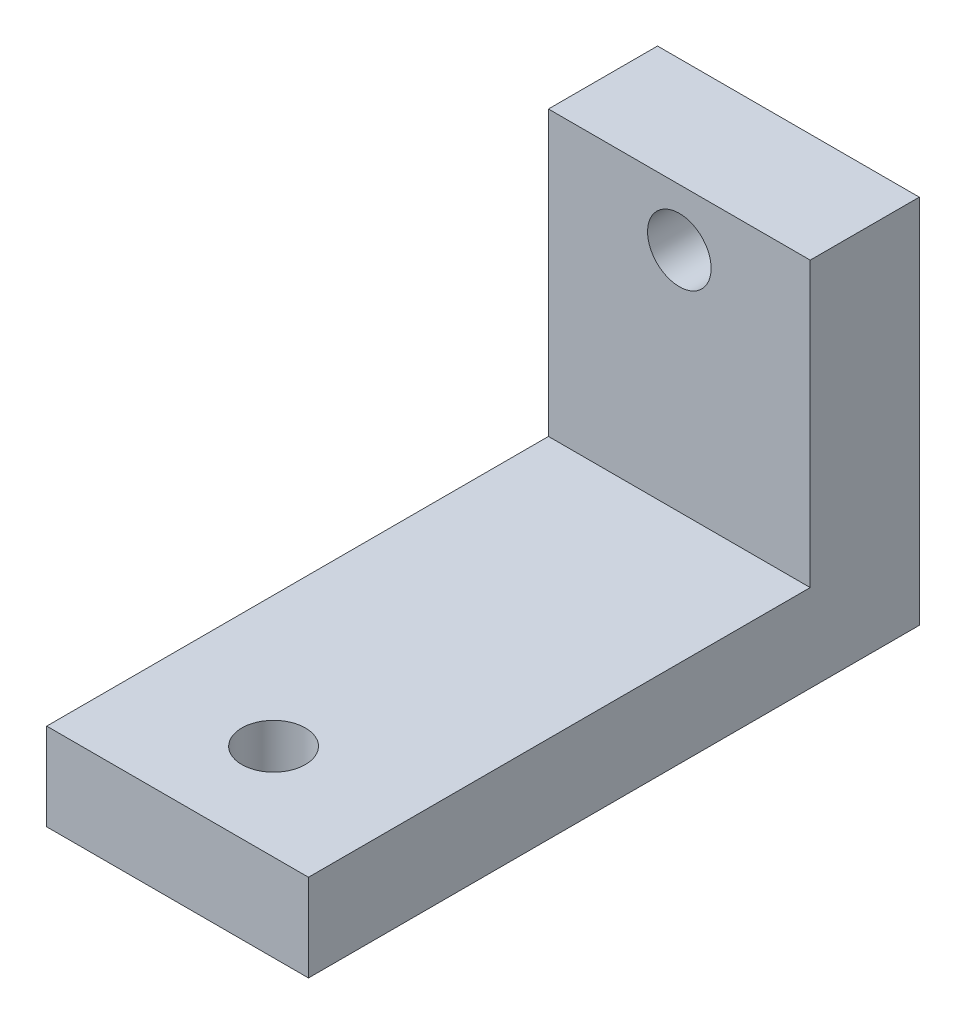
ISO-10303-21;
HEADER;
FILE_DESCRIPTION(('STEP AP214'),'2;1');
FILE_NAME('part.step','',(''),(''),'','','');
FILE_SCHEMA(('AUTOMOTIVE_DESIGN { 1 0 10303 214 1 1 1 1 }'));
ENDSEC;
DATA;
#1=APPLICATION_CONTEXT('core data for automotive mechanical design processes');
#2=APPLICATION_PROTOCOL_DEFINITION('international standard','automotive_design',2000,#1);
#3=PRODUCT_CONTEXT('',#1,'mechanical');
#4=PRODUCT('Part','Part','',(#3));
#5=PRODUCT_RELATED_PRODUCT_CATEGORY('part','',(#4));
#6=PRODUCT_DEFINITION_FORMATION('','',#4);
#7=PRODUCT_DEFINITION_CONTEXT('part definition',#1,'design');
#8=PRODUCT_DEFINITION('design','',#6,#7);
#9=PRODUCT_DEFINITION_SHAPE('','',#8);
#10=(LENGTH_UNIT() NAMED_UNIT(*) SI_UNIT(.MILLI.,.METRE.));
#11=(NAMED_UNIT(*) PLANE_ANGLE_UNIT() SI_UNIT($,.RADIAN.));
#12=(NAMED_UNIT(*) SI_UNIT($,.STERADIAN.) SOLID_ANGLE_UNIT());
#13=UNCERTAINTY_MEASURE_WITH_UNIT(LENGTH_MEASURE(1.E-05),#10,'distance_accuracy_value','');
#14=(GEOMETRIC_REPRESENTATION_CONTEXT(3) GLOBAL_UNCERTAINTY_ASSIGNED_CONTEXT((#13)) GLOBAL_UNIT_ASSIGNED_CONTEXT((#10,
#11,#12)) REPRESENTATION_CONTEXT('',''));
#15=CARTESIAN_POINT('',(0.,0.,0.));
#16=DIRECTION('',(0.,0.,1.));
#17=DIRECTION('',(1.,0.,0.));
#18=AXIS2_PLACEMENT_3D('',#15,#16,#17);
#19=CARTESIAN_POINT('',(-7.62,21.59,4.43938053097346));
#20=DIRECTION('',(0.,0.,-1.));
#21=DIRECTION('',(-1.,0.,0.));
#22=AXIS2_PLACEMENT_3D('',#19,#20,#21);
#23=PLANE('',#22);
#24=CARTESIAN_POINT('',(0.,18.288,4.43938053097346));
#25=DIRECTION('',(0.,0.,1.));
#26=DIRECTION('',(1.,0.,0.));
#27=AXIS2_PLACEMENT_3D('',#24,#25,#26);
#28=CIRCLE('',#27,1.84999999999999);
#29=CARTESIAN_POINT('',(1.84999999999999,18.288,4.43938053097346));
#30=VERTEX_POINT('',#29);
#31=EDGE_CURVE('E179',#30,#30,#28,.T.);
#32=ORIENTED_EDGE('',*,*,#31,.F.);
#33=EDGE_LOOP('',(#32));
#34=FACE_BOUND('',#33,.T.);
#35=DIRECTION('',(-1.,0.,0.));
#36=VECTOR('',#35,1.);
#37=CARTESIAN_POINT('',(-7.62,5.08,4.43938053097346));
#38=LINE('',#37,#36);
#39=CARTESIAN_POINT('',(7.62,5.08,4.43938053097346));
#40=VERTEX_POINT('',#39);
#41=CARTESIAN_POINT('',(-7.62,5.08,4.43938053097346));
#42=VERTEX_POINT('',#41);
#43=EDGE_CURVE('E46',#40,#42,#38,.T.);
#44=ORIENTED_EDGE('',*,*,#43,.F.);
#45=DIRECTION('',(0.,-1.,0.));
#46=VECTOR('',#45,1.);
#47=CARTESIAN_POINT('',(7.62,21.59,4.43938053097346));
#48=LINE('',#47,#46);
#49=CARTESIAN_POINT('',(7.62,21.59,4.43938053097346));
#50=VERTEX_POINT('',#49);
#51=EDGE_CURVE('E40',#50,#40,#48,.T.);
#52=ORIENTED_EDGE('',*,*,#51,.F.);
#53=DIRECTION('',(1.,0.,0.));
#54=VECTOR('',#53,1.);
#55=CARTESIAN_POINT('',(-7.62,21.59,4.43938053097346));
#56=LINE('',#55,#54);
#57=CARTESIAN_POINT('',(-7.62,21.59,4.43938053097346));
#58=VERTEX_POINT('',#57);
#59=EDGE_CURVE('E75',#58,#50,#56,.T.);
#60=ORIENTED_EDGE('',*,*,#59,.F.);
#61=DIRECTION('',(0.,-1.,0.));
#62=VECTOR('',#61,1.);
#63=CARTESIAN_POINT('',(-7.62,21.59,4.43938053097346));
#64=LINE('',#63,#62);
#65=EDGE_CURVE('E11',#58,#42,#64,.T.);
#66=ORIENTED_EDGE('',*,*,#65,.T.);
#67=EDGE_LOOP('',(#44,#52,#60,#66));
#68=FACE_BOUND('',#67,.T.);
#69=ADVANCED_FACE('F32',(#34,#68),#23,.F.);
#70=CARTESIAN_POINT('',(-7.62,21.59,-1.91061946902654));
#71=DIRECTION('',(1.,0.,0.));
#72=DIRECTION('',(0.,0.,-1.));
#73=AXIS2_PLACEMENT_3D('',#70,#71,#72);
#74=PLANE('',#73);
#75=DIRECTION('',(0.,0.,1.));
#76=VECTOR('',#75,1.);
#77=CARTESIAN_POINT('',(-7.62,0.,-1.91061946902654));
#78=LINE('',#77,#76);
#79=CARTESIAN_POINT('',(-7.62,0.,-1.91061946902654));
#80=VERTEX_POINT('',#79);
#81=CARTESIAN_POINT('',(-7.62,0.,33.6493805309735));
#82=VERTEX_POINT('',#81);
#83=EDGE_CURVE('E92',#80,#82,#78,.T.);
#84=ORIENTED_EDGE('',*,*,#83,.T.);
#85=DIRECTION('',(0.,-1.,0.));
#86=VECTOR('',#85,1.);
#87=CARTESIAN_POINT('',(-7.62,0.,33.6493805309735));
#88=LINE('',#87,#86);
#89=CARTESIAN_POINT('',(-7.62,5.08,33.6493805309735));
#90=VERTEX_POINT('',#89);
#91=EDGE_CURVE('E96',#90,#82,#88,.T.);
#92=ORIENTED_EDGE('',*,*,#91,.F.);
#93=DIRECTION('',(0.,0.,-1.));
#94=VECTOR('',#93,1.);
#95=CARTESIAN_POINT('',(-7.62,5.08,33.6493805309735));
#96=LINE('',#95,#94);
#97=EDGE_CURVE('E121',#90,#42,#96,.T.);
#98=ORIENTED_EDGE('',*,*,#97,.T.);
#99=ORIENTED_EDGE('',*,*,#65,.F.);
#100=DIRECTION('',(0.,0.,1.));
#101=VECTOR('',#100,1.);
#102=CARTESIAN_POINT('',(-7.62,21.59,-1.91061946902654));
#103=LINE('',#102,#101);
#104=CARTESIAN_POINT('',(-7.62,21.59,-1.91061946902654));
#105=VERTEX_POINT('',#104);
#106=EDGE_CURVE('E126',#105,#58,#103,.T.);
#107=ORIENTED_EDGE('',*,*,#106,.F.);
#108=DIRECTION('',(0.,-1.,0.));
#109=VECTOR('',#108,1.);
#110=CARTESIAN_POINT('',(-7.62,21.59,-1.91061946902654));
#111=LINE('',#110,#109);
#112=EDGE_CURVE('E98',#105,#80,#111,.T.);
#113=ORIENTED_EDGE('',*,*,#112,.T.);
#114=EDGE_LOOP('',(#84,#92,#98,#99,#107,#113));
#115=FACE_BOUND('',#114,.T.);
#116=ADVANCED_FACE('F34',(#115),#74,.F.);
#117=CARTESIAN_POINT('',(7.62,21.59,-1.91061946902654));
#118=DIRECTION('',(-1.,0.,0.));
#119=DIRECTION('',(0.,0.,1.));
#120=AXIS2_PLACEMENT_3D('',#117,#118,#119);
#121=PLANE('',#120);
#122=DIRECTION('',(0.,0.,-1.));
#123=VECTOR('',#122,1.);
#124=CARTESIAN_POINT('',(7.62,0.,-1.91061946902654));
#125=LINE('',#124,#123);
#126=CARTESIAN_POINT('',(7.62,0.,33.6493805309735));
#127=VERTEX_POINT('',#126);
#128=CARTESIAN_POINT('',(7.62,0.,-1.91061946902654));
#129=VERTEX_POINT('',#128);
#130=EDGE_CURVE('E100',#127,#129,#125,.T.);
#131=ORIENTED_EDGE('',*,*,#130,.T.);
#132=DIRECTION('',(0.,-1.,0.));
#133=VECTOR('',#132,1.);
#134=CARTESIAN_POINT('',(7.62,21.59,-1.91061946902654));
#135=LINE('',#134,#133);
#136=CARTESIAN_POINT('',(7.62,21.59,-1.91061946902654));
#137=VERTEX_POINT('',#136);
#138=EDGE_CURVE('E135',#137,#129,#135,.T.);
#139=ORIENTED_EDGE('',*,*,#138,.F.);
#140=DIRECTION('',(0.,0.,-1.));
#141=VECTOR('',#140,1.);
#142=CARTESIAN_POINT('',(7.62,21.59,-1.91061946902654));
#143=LINE('',#142,#141);
#144=EDGE_CURVE('E129',#50,#137,#143,.T.);
#145=ORIENTED_EDGE('',*,*,#144,.F.);
#146=ORIENTED_EDGE('',*,*,#51,.T.);
#147=DIRECTION('',(0.,0.,-1.));
#148=VECTOR('',#147,1.);
#149=CARTESIAN_POINT('',(7.62,5.08,33.6493805309735));
#150=LINE('',#149,#148);
#151=CARTESIAN_POINT('',(7.62,5.08,33.6493805309735));
#152=VERTEX_POINT('',#151);
#153=EDGE_CURVE('E101',#152,#40,#150,.T.);
#154=ORIENTED_EDGE('',*,*,#153,.F.);
#155=DIRECTION('',(0.,1.,0.));
#156=VECTOR('',#155,1.);
#157=CARTESIAN_POINT('',(7.62,0.,33.6493805309735));
#158=LINE('',#157,#156);
#159=EDGE_CURVE('E108',#127,#152,#158,.T.);
#160=ORIENTED_EDGE('',*,*,#159,.F.);
#161=EDGE_LOOP('',(#131,#139,#145,#146,#154,#160));
#162=FACE_BOUND('',#161,.T.);
#163=ADVANCED_FACE('F139',(#162),#121,.F.);
#164=CARTESIAN_POINT('',(-7.62,21.59,-1.91061946902654));
#165=DIRECTION('',(0.,0.,1.));
#166=DIRECTION('',(1.,0.,0.));
#167=AXIS2_PLACEMENT_3D('',#164,#165,#166);
#168=PLANE('',#167);
#169=CARTESIAN_POINT('',(0.,18.288,-1.91061946902654));
#170=DIRECTION('',(0.,0.,1.));
#171=DIRECTION('',(1.,0.,0.));
#172=AXIS2_PLACEMENT_3D('',#169,#170,#171);
#173=CIRCLE('',#172,1.84999999999999);
#174=CARTESIAN_POINT('',(1.84999999999999,18.288,-1.91061946902654));
#175=VERTEX_POINT('',#174);
#176=EDGE_CURVE('E182',#175,#175,#173,.T.);
#177=ORIENTED_EDGE('',*,*,#176,.T.);
#178=EDGE_LOOP('',(#177));
#179=FACE_BOUND('',#178,.T.);
#180=DIRECTION('',(-1.,0.,0.));
#181=VECTOR('',#180,1.);
#182=CARTESIAN_POINT('',(-7.62,0.,-1.91061946902654));
#183=LINE('',#182,#181);
#184=EDGE_CURVE('E70',#129,#80,#183,.T.);
#185=ORIENTED_EDGE('',*,*,#184,.T.);
#186=ORIENTED_EDGE('',*,*,#112,.F.);
#187=DIRECTION('',(-1.,0.,0.));
#188=VECTOR('',#187,1.);
#189=CARTESIAN_POINT('',(-7.62,21.59,-1.91061946902654));
#190=LINE('',#189,#188);
#191=EDGE_CURVE('E55',#137,#105,#190,.T.);
#192=ORIENTED_EDGE('',*,*,#191,.F.);
#193=ORIENTED_EDGE('',*,*,#138,.T.);
#194=EDGE_LOOP('',(#185,#186,#192,#193));
#195=FACE_BOUND('',#194,.T.);
#196=ADVANCED_FACE('F153',(#179,#195),#168,.F.);
#197=CARTESIAN_POINT('',(0.,21.59,0.));
#198=DIRECTION('',(0.,1.,0.));
#199=DIRECTION('',(0.,0.,1.));
#200=AXIS2_PLACEMENT_3D('',#197,#198,#199);
#201=PLANE('',#200);
#202=ORIENTED_EDGE('',*,*,#106,.T.);
#203=ORIENTED_EDGE('',*,*,#59,.T.);
#204=ORIENTED_EDGE('',*,*,#144,.T.);
#205=ORIENTED_EDGE('',*,*,#191,.T.);
#206=EDGE_LOOP('',(#202,#203,#204,#205));
#207=FACE_BOUND('',#206,.T.);
#208=ADVANCED_FACE('F156',(#207),#201,.T.);
#209=CARTESIAN_POINT('',(0.,0.,0.));
#210=DIRECTION('',(0.,1.,0.));
#211=DIRECTION('',(0.,0.,1.));
#212=AXIS2_PLACEMENT_3D('',#209,#210,#211);
#213=PLANE('',#212);
#214=CARTESIAN_POINT('',(0.,0.,28.0613805309735));
#215=DIRECTION('',(0.,1.,0.));
#216=DIRECTION('',(0.,0.,1.));
#217=AXIS2_PLACEMENT_3D('',#214,#215,#216);
#218=CIRCLE('',#217,1.85);
#219=CARTESIAN_POINT('',(0.,0.,29.9113805309734));
#220=VERTEX_POINT('',#219);
#221=EDGE_CURVE('E115',#220,#220,#218,.T.);
#222=ORIENTED_EDGE('',*,*,#221,.T.);
#223=EDGE_LOOP('',(#222));
#224=FACE_BOUND('',#223,.T.);
#225=ORIENTED_EDGE('',*,*,#83,.F.);
#226=ORIENTED_EDGE('',*,*,#184,.F.);
#227=ORIENTED_EDGE('',*,*,#130,.F.);
#228=DIRECTION('',(1.,0.,0.));
#229=VECTOR('',#228,1.);
#230=CARTESIAN_POINT('',(-7.62,0.,33.6493805309735));
#231=LINE('',#230,#229);
#232=EDGE_CURVE('E104',#82,#127,#231,.T.);
#233=ORIENTED_EDGE('',*,*,#232,.F.);
#234=EDGE_LOOP('',(#225,#226,#227,#233));
#235=FACE_BOUND('',#234,.T.);
#236=ADVANCED_FACE('F105',(#224,#235),#213,.F.);
#237=CARTESIAN_POINT('',(-7.62,5.08,33.6493805309735));
#238=DIRECTION('',(0.,-1.,0.));
#239=DIRECTION('',(0.,0.,-1.));
#240=AXIS2_PLACEMENT_3D('',#237,#238,#239);
#241=PLANE('',#240);
#242=CARTESIAN_POINT('',(0.,5.08,28.0613805309735));
#243=DIRECTION('',(0.,1.,0.));
#244=DIRECTION('',(0.,0.,1.));
#245=AXIS2_PLACEMENT_3D('',#242,#243,#244);
#246=CIRCLE('',#245,1.85);
#247=CARTESIAN_POINT('',(0.,5.08,29.9113805309735));
#248=VERTEX_POINT('',#247);
#249=EDGE_CURVE('E183',#248,#248,#246,.T.);
#250=ORIENTED_EDGE('',*,*,#249,.F.);
#251=EDGE_LOOP('',(#250));
#252=FACE_BOUND('',#251,.T.);
#253=ORIENTED_EDGE('',*,*,#43,.T.);
#254=ORIENTED_EDGE('',*,*,#97,.F.);
#255=DIRECTION('',(-1.,0.,0.));
#256=VECTOR('',#255,1.);
#257=CARTESIAN_POINT('',(-7.62,5.08,33.6493805309735));
#258=LINE('',#257,#256);
#259=EDGE_CURVE('E112',#152,#90,#258,.T.);
#260=ORIENTED_EDGE('',*,*,#259,.F.);
#261=ORIENTED_EDGE('',*,*,#153,.T.);
#262=EDGE_LOOP('',(#253,#254,#260,#261));
#263=FACE_BOUND('',#262,.T.);
#264=ADVANCED_FACE('F142',(#252,#263),#241,.F.);
#265=CARTESIAN_POINT('',(0.,0.,33.6493805309735));
#266=DIRECTION('',(0.,0.,-1.));
#267=DIRECTION('',(-1.,0.,0.));
#268=AXIS2_PLACEMENT_3D('',#265,#266,#267);
#269=PLANE('',#268);
#270=ORIENTED_EDGE('',*,*,#91,.T.);
#271=ORIENTED_EDGE('',*,*,#232,.T.);
#272=ORIENTED_EDGE('',*,*,#159,.T.);
#273=ORIENTED_EDGE('',*,*,#259,.T.);
#274=EDGE_LOOP('',(#270,#271,#272,#273));
#275=FACE_BOUND('',#274,.T.);
#276=ADVANCED_FACE('F110',(#275),#269,.F.);
#277=CARTESIAN_POINT('',(0.,5.08,28.0613805309735));
#278=DIRECTION('',(0.,1.,0.));
#279=DIRECTION('',(0.,0.,1.));
#280=AXIS2_PLACEMENT_3D('',#277,#278,#279);
#281=CYLINDRICAL_SURFACE('',#280,1.85);
#282=ORIENTED_EDGE('',*,*,#249,.T.);
#283=EDGE_LOOP('',(#282));
#284=FACE_BOUND('',#283,.T.);
#285=ORIENTED_EDGE('',*,*,#221,.F.);
#286=EDGE_LOOP('',(#285));
#287=FACE_BOUND('',#286,.T.);
#288=ADVANCED_FACE('F168',(#284,#287),#281,.F.);
#289=CARTESIAN_POINT('',(0.,18.288,4.43938053097346));
#290=DIRECTION('',(0.,0.,1.));
#291=DIRECTION('',(1.,0.,0.));
#292=AXIS2_PLACEMENT_3D('',#289,#290,#291);
#293=CYLINDRICAL_SURFACE('',#292,1.84999999999999);
#294=ORIENTED_EDGE('',*,*,#31,.T.);
#295=EDGE_LOOP('',(#294));
#296=FACE_BOUND('',#295,.T.);
#297=ORIENTED_EDGE('',*,*,#176,.F.);
#298=EDGE_LOOP('',(#297));
#299=FACE_BOUND('',#298,.T.);
#300=ADVANCED_FACE('F171',(#296,#299),#293,.F.);
#301=CLOSED_SHELL('',(#69,#116,#163,#196,#208,#236,#264,#276,#288,#300));
#302=MANIFOLD_SOLID_BREP('B2',#301);
#303=ADVANCED_BREP_SHAPE_REPRESENTATION('',(#18,#302),#14);
#304=SHAPE_DEFINITION_REPRESENTATION(#9,#303);
ENDSEC;
END-ISO-10303-21;
